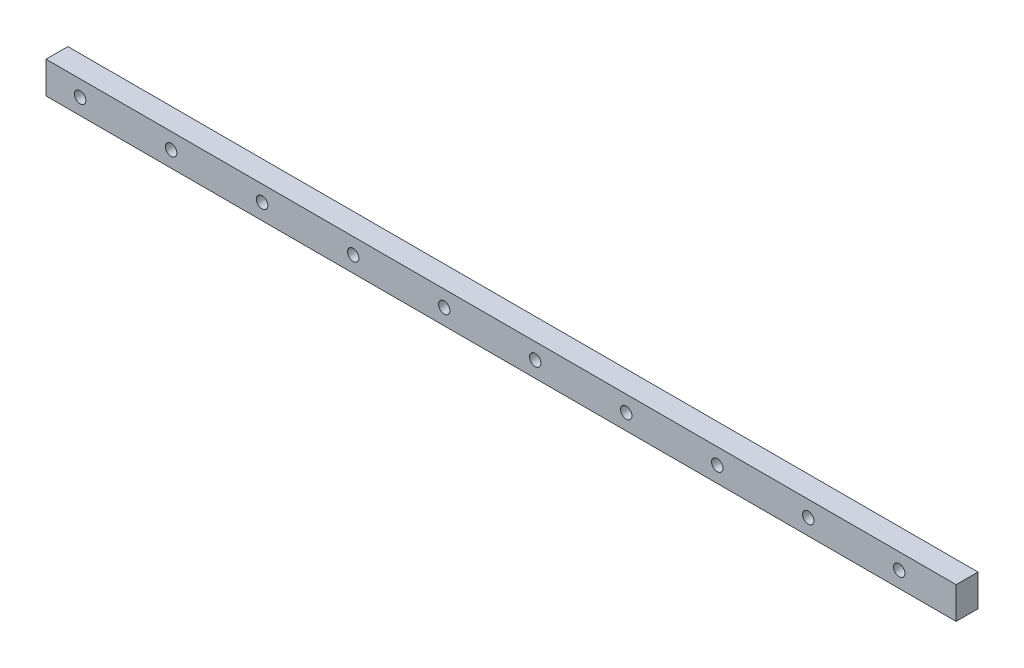
ISO-10303-21;
HEADER;
FILE_DESCRIPTION(('STEP AP214'),'2;1');
FILE_NAME('part.step','',(''),(''),'','','');
FILE_SCHEMA(('AUTOMOTIVE_DESIGN { 1 0 10303 214 1 1 1 1 }'));
ENDSEC;
DATA;
#1=APPLICATION_CONTEXT('core data for automotive mechanical design processes');
#2=APPLICATION_PROTOCOL_DEFINITION('international standard','automotive_design',2000,#1);
#3=PRODUCT_CONTEXT('',#1,'mechanical');
#4=PRODUCT('Part','Part','',(#3));
#5=PRODUCT_RELATED_PRODUCT_CATEGORY('part','',(#4));
#6=PRODUCT_DEFINITION_FORMATION('','',#4);
#7=PRODUCT_DEFINITION_CONTEXT('part definition',#1,'design');
#8=PRODUCT_DEFINITION('design','',#6,#7);
#9=PRODUCT_DEFINITION_SHAPE('','',#8);
#10=(LENGTH_UNIT() NAMED_UNIT(*) SI_UNIT(.MILLI.,.METRE.));
#11=(NAMED_UNIT(*) PLANE_ANGLE_UNIT() SI_UNIT($,.RADIAN.));
#12=(NAMED_UNIT(*) SI_UNIT($,.STERADIAN.) SOLID_ANGLE_UNIT());
#13=UNCERTAINTY_MEASURE_WITH_UNIT(LENGTH_MEASURE(1.E-05),#10,'distance_accuracy_value','');
#14=(GEOMETRIC_REPRESENTATION_CONTEXT(3) GLOBAL_UNCERTAINTY_ASSIGNED_CONTEXT((#13)) GLOBAL_UNIT_ASSIGNED_CONTEXT((#10,
#11,#12)) REPRESENTATION_CONTEXT('',''));
#15=CARTESIAN_POINT('',(0.,0.,0.));
#16=DIRECTION('',(0.,0.,1.));
#17=DIRECTION('',(1.,0.,0.));
#18=AXIS2_PLACEMENT_3D('',#15,#16,#17);
#19=CARTESIAN_POINT('',(0.,0.,4.8));
#20=DIRECTION('',(0.,0.,1.));
#21=DIRECTION('',(1.,0.,0.));
#22=AXIS2_PLACEMENT_3D('',#19,#20,#21);
#23=PLANE('',#22);
#24=CARTESIAN_POINT('',(167.5,-3.5,4.8));
#25=DIRECTION('',(0.,0.,1.));
#26=DIRECTION('',(1.,0.,0.));
#27=AXIS2_PLACEMENT_3D('',#24,#25,#26);
#28=CIRCLE('',#27,1.24999999999998);
#29=CARTESIAN_POINT('',(168.75,-3.5,4.8));
#30=VERTEX_POINT('',#29);
#31=EDGE_CURVE('E165',#30,#30,#28,.T.);
#32=ORIENTED_EDGE('',*,*,#31,.F.);
#33=EDGE_LOOP('',(#32));
#34=FACE_BOUND('',#33,.T.);
#35=CARTESIAN_POINT('',(127.5,-3.5,4.8));
#36=DIRECTION('',(0.,0.,1.));
#37=DIRECTION('',(1.,0.,0.));
#38=AXIS2_PLACEMENT_3D('',#35,#36,#37);
#39=CIRCLE('',#38,1.24999999999998);
#40=CARTESIAN_POINT('',(128.75,-3.5,4.8));
#41=VERTEX_POINT('',#40);
#42=EDGE_CURVE('E153',#41,#41,#39,.T.);
#43=ORIENTED_EDGE('',*,*,#42,.F.);
#44=EDGE_LOOP('',(#43));
#45=FACE_BOUND('',#44,.T.);
#46=CARTESIAN_POINT('',(87.5,-3.5,4.8));
#47=DIRECTION('',(0.,0.,1.));
#48=DIRECTION('',(1.,0.,0.));
#49=AXIS2_PLACEMENT_3D('',#46,#47,#48);
#50=CIRCLE('',#49,1.25000000000001);
#51=CARTESIAN_POINT('',(88.75,-3.5,4.8));
#52=VERTEX_POINT('',#51);
#53=EDGE_CURVE('E141',#52,#52,#50,.T.);
#54=ORIENTED_EDGE('',*,*,#53,.F.);
#55=EDGE_LOOP('',(#54));
#56=FACE_BOUND('',#55,.T.);
#57=CARTESIAN_POINT('',(47.5,-3.5,4.8));
#58=DIRECTION('',(0.,0.,1.));
#59=DIRECTION('',(1.,0.,0.));
#60=AXIS2_PLACEMENT_3D('',#57,#58,#59);
#61=CIRCLE('',#60,1.25);
#62=CARTESIAN_POINT('',(48.75,-3.5,4.8));
#63=VERTEX_POINT('',#62);
#64=EDGE_CURVE('E129',#63,#63,#61,.T.);
#65=ORIENTED_EDGE('',*,*,#64,.F.);
#66=EDGE_LOOP('',(#65));
#67=FACE_BOUND('',#66,.T.);
#68=CARTESIAN_POINT('',(7.5,-3.5,4.8));
#69=DIRECTION('',(0.,0.,1.));
#70=DIRECTION('',(1.,0.,0.));
#71=AXIS2_PLACEMENT_3D('',#68,#69,#70);
#72=CIRCLE('',#71,1.25);
#73=CARTESIAN_POINT('',(8.75,-3.5,4.8));
#74=VERTEX_POINT('',#73);
#75=EDGE_CURVE('E108',#74,#74,#72,.T.);
#76=ORIENTED_EDGE('',*,*,#75,.F.);
#77=EDGE_LOOP('',(#76));
#78=FACE_BOUND('',#77,.T.);
#79=DIRECTION('',(0.,-1.,0.));
#80=VECTOR('',#79,1.);
#81=CARTESIAN_POINT('',(0.,0.,4.8));
#82=LINE('',#81,#80);
#83=CARTESIAN_POINT('',(0.,0.,4.8));
#84=VERTEX_POINT('',#83);
#85=CARTESIAN_POINT('',(0.,-7.,4.8));
#86=VERTEX_POINT('',#85);
#87=EDGE_CURVE('E93',#84,#86,#82,.T.);
#88=ORIENTED_EDGE('',*,*,#87,.T.);
#89=DIRECTION('',(1.,0.,0.));
#90=VECTOR('',#89,1.);
#91=CARTESIAN_POINT('',(0.,-7.,4.8));
#92=LINE('',#91,#90);
#93=CARTESIAN_POINT('',(200.,-7.,4.8));
#94=VERTEX_POINT('',#93);
#95=EDGE_CURVE('E88',#86,#94,#92,.T.);
#96=ORIENTED_EDGE('',*,*,#95,.T.);
#97=DIRECTION('',(0.,1.,0.));
#98=VECTOR('',#97,1.);
#99=CARTESIAN_POINT('',(200.,0.,4.8));
#100=LINE('',#99,#98);
#101=CARTESIAN_POINT('',(200.,0.,4.8));
#102=VERTEX_POINT('',#101);
#103=EDGE_CURVE('E91',#94,#102,#100,.T.);
#104=ORIENTED_EDGE('',*,*,#103,.T.);
#105=DIRECTION('',(-1.,0.,0.));
#106=VECTOR('',#105,1.);
#107=CARTESIAN_POINT('',(0.,0.,4.8));
#108=LINE('',#107,#106);
#109=EDGE_CURVE('E58',#102,#84,#108,.T.);
#110=ORIENTED_EDGE('',*,*,#109,.T.);
#111=EDGE_LOOP('',(#88,#96,#104,#110));
#112=FACE_BOUND('',#111,.T.);
#113=CARTESIAN_POINT('',(27.5,-3.5,4.8));
#114=DIRECTION('',(0.,0.,1.));
#115=DIRECTION('',(1.,0.,0.));
#116=AXIS2_PLACEMENT_3D('',#113,#114,#115);
#117=CIRCLE('',#116,1.25);
#118=CARTESIAN_POINT('',(28.75,-3.5,4.8));
#119=VERTEX_POINT('',#118);
#120=EDGE_CURVE('E123',#119,#119,#117,.T.);
#121=ORIENTED_EDGE('',*,*,#120,.F.);
#122=EDGE_LOOP('',(#121));
#123=FACE_BOUND('',#122,.T.);
#124=CARTESIAN_POINT('',(67.5,-3.5,4.8));
#125=DIRECTION('',(0.,0.,1.));
#126=DIRECTION('',(1.,0.,0.));
#127=AXIS2_PLACEMENT_3D('',#124,#125,#126);
#128=CIRCLE('',#127,1.25);
#129=CARTESIAN_POINT('',(68.75,-3.5,4.8));
#130=VERTEX_POINT('',#129);
#131=EDGE_CURVE('E135',#130,#130,#128,.T.);
#132=ORIENTED_EDGE('',*,*,#131,.F.);
#133=EDGE_LOOP('',(#132));
#134=FACE_BOUND('',#133,.T.);
#135=CARTESIAN_POINT('',(107.5,-3.5,4.8));
#136=DIRECTION('',(0.,0.,1.));
#137=DIRECTION('',(1.,0.,0.));
#138=AXIS2_PLACEMENT_3D('',#135,#136,#137);
#139=CIRCLE('',#138,1.25);
#140=CARTESIAN_POINT('',(108.75,-3.5,4.8));
#141=VERTEX_POINT('',#140);
#142=EDGE_CURVE('E147',#141,#141,#139,.T.);
#143=ORIENTED_EDGE('',*,*,#142,.F.);
#144=EDGE_LOOP('',(#143));
#145=FACE_BOUND('',#144,.T.);
#146=CARTESIAN_POINT('',(147.5,-3.5,4.8));
#147=DIRECTION('',(0.,0.,1.));
#148=DIRECTION('',(1.,0.,0.));
#149=AXIS2_PLACEMENT_3D('',#146,#147,#148);
#150=CIRCLE('',#149,1.24999999999998);
#151=CARTESIAN_POINT('',(148.75,-3.5,4.8));
#152=VERTEX_POINT('',#151);
#153=EDGE_CURVE('E159',#152,#152,#150,.T.);
#154=ORIENTED_EDGE('',*,*,#153,.F.);
#155=EDGE_LOOP('',(#154));
#156=FACE_BOUND('',#155,.T.);
#157=CARTESIAN_POINT('',(187.5,-3.5,4.8));
#158=DIRECTION('',(0.,0.,1.));
#159=DIRECTION('',(1.,0.,0.));
#160=AXIS2_PLACEMENT_3D('',#157,#158,#159);
#161=CIRCLE('',#160,1.24999999999998);
#162=CARTESIAN_POINT('',(188.75,-3.5,4.8));
#163=VERTEX_POINT('',#162);
#164=EDGE_CURVE('E171',#163,#163,#161,.T.);
#165=ORIENTED_EDGE('',*,*,#164,.F.);
#166=EDGE_LOOP('',(#165));
#167=FACE_BOUND('',#166,.T.);
#168=ADVANCED_FACE('F41',(#34,#45,#56,#67,#78,#112,#123,#134,#145,#156,#167),#23,.T.);
#169=CARTESIAN_POINT('',(0.,0.,0.));
#170=DIRECTION('',(0.,0.,1.));
#171=DIRECTION('',(1.,0.,0.));
#172=AXIS2_PLACEMENT_3D('',#169,#170,#171);
#173=PLANE('',#172);
#174=DIRECTION('',(0.,-1.,0.));
#175=VECTOR('',#174,1.);
#176=CARTESIAN_POINT('',(0.,0.,0.));
#177=LINE('',#176,#175);
#178=CARTESIAN_POINT('',(0.,0.,0.));
#179=VERTEX_POINT('',#178);
#180=CARTESIAN_POINT('',(0.,-7.,0.));
#181=VERTEX_POINT('',#180);
#182=EDGE_CURVE('E105',#179,#181,#177,.T.);
#183=ORIENTED_EDGE('',*,*,#182,.F.);
#184=DIRECTION('',(-1.,0.,0.));
#185=VECTOR('',#184,1.);
#186=CARTESIAN_POINT('',(0.,0.,0.));
#187=LINE('',#186,#185);
#188=CARTESIAN_POINT('',(200.,0.,0.));
#189=VERTEX_POINT('',#188);
#190=EDGE_CURVE('E81',#189,#179,#187,.T.);
#191=ORIENTED_EDGE('',*,*,#190,.F.);
#192=DIRECTION('',(0.,1.,0.));
#193=VECTOR('',#192,1.);
#194=CARTESIAN_POINT('',(200.,0.,0.));
#195=LINE('',#194,#193);
#196=CARTESIAN_POINT('',(200.,-7.,0.));
#197=VERTEX_POINT('',#196);
#198=EDGE_CURVE('E75',#197,#189,#195,.T.);
#199=ORIENTED_EDGE('',*,*,#198,.F.);
#200=DIRECTION('',(1.,0.,0.));
#201=VECTOR('',#200,1.);
#202=CARTESIAN_POINT('',(0.,-7.,0.));
#203=LINE('',#202,#201);
#204=EDGE_CURVE('E97',#181,#197,#203,.T.);
#205=ORIENTED_EDGE('',*,*,#204,.F.);
#206=EDGE_LOOP('',(#183,#191,#199,#205));
#207=FACE_BOUND('',#206,.T.);
#208=CARTESIAN_POINT('',(7.5,-3.5,0.));
#209=DIRECTION('',(0.,0.,1.));
#210=DIRECTION('',(1.,0.,0.));
#211=AXIS2_PLACEMENT_3D('',#208,#209,#210);
#212=CIRCLE('',#211,1.25);
#213=CARTESIAN_POINT('',(8.75,-3.5,0.));
#214=VERTEX_POINT('',#213);
#215=EDGE_CURVE('E120',#214,#214,#212,.T.);
#216=ORIENTED_EDGE('',*,*,#215,.T.);
#217=EDGE_LOOP('',(#216));
#218=FACE_BOUND('',#217,.T.);
#219=CARTESIAN_POINT('',(27.5,-3.5,0.));
#220=DIRECTION('',(0.,0.,1.));
#221=DIRECTION('',(1.,0.,0.));
#222=AXIS2_PLACEMENT_3D('',#219,#220,#221);
#223=CIRCLE('',#222,1.25);
#224=CARTESIAN_POINT('',(28.75,-3.5,0.));
#225=VERTEX_POINT('',#224);
#226=EDGE_CURVE('E126',#225,#225,#223,.T.);
#227=ORIENTED_EDGE('',*,*,#226,.T.);
#228=EDGE_LOOP('',(#227));
#229=FACE_BOUND('',#228,.T.);
#230=CARTESIAN_POINT('',(47.5,-3.5,0.));
#231=DIRECTION('',(0.,0.,1.));
#232=DIRECTION('',(1.,0.,0.));
#233=AXIS2_PLACEMENT_3D('',#230,#231,#232);
#234=CIRCLE('',#233,1.25);
#235=CARTESIAN_POINT('',(48.75,-3.5,0.));
#236=VERTEX_POINT('',#235);
#237=EDGE_CURVE('E132',#236,#236,#234,.T.);
#238=ORIENTED_EDGE('',*,*,#237,.T.);
#239=EDGE_LOOP('',(#238));
#240=FACE_BOUND('',#239,.T.);
#241=CARTESIAN_POINT('',(67.5,-3.5,0.));
#242=DIRECTION('',(0.,0.,1.));
#243=DIRECTION('',(1.,0.,0.));
#244=AXIS2_PLACEMENT_3D('',#241,#242,#243);
#245=CIRCLE('',#244,1.25);
#246=CARTESIAN_POINT('',(68.75,-3.5,0.));
#247=VERTEX_POINT('',#246);
#248=EDGE_CURVE('E138',#247,#247,#245,.T.);
#249=ORIENTED_EDGE('',*,*,#248,.T.);
#250=EDGE_LOOP('',(#249));
#251=FACE_BOUND('',#250,.T.);
#252=CARTESIAN_POINT('',(87.5,-3.5,0.));
#253=DIRECTION('',(0.,0.,1.));
#254=DIRECTION('',(1.,0.,0.));
#255=AXIS2_PLACEMENT_3D('',#252,#253,#254);
#256=CIRCLE('',#255,1.25000000000001);
#257=CARTESIAN_POINT('',(88.75,-3.5,0.));
#258=VERTEX_POINT('',#257);
#259=EDGE_CURVE('E144',#258,#258,#256,.T.);
#260=ORIENTED_EDGE('',*,*,#259,.T.);
#261=EDGE_LOOP('',(#260));
#262=FACE_BOUND('',#261,.T.);
#263=CARTESIAN_POINT('',(107.5,-3.5,0.));
#264=DIRECTION('',(0.,0.,1.));
#265=DIRECTION('',(1.,0.,0.));
#266=AXIS2_PLACEMENT_3D('',#263,#264,#265);
#267=CIRCLE('',#266,1.25);
#268=CARTESIAN_POINT('',(108.75,-3.5,0.));
#269=VERTEX_POINT('',#268);
#270=EDGE_CURVE('E150',#269,#269,#267,.T.);
#271=ORIENTED_EDGE('',*,*,#270,.T.);
#272=EDGE_LOOP('',(#271));
#273=FACE_BOUND('',#272,.T.);
#274=CARTESIAN_POINT('',(127.5,-3.5,0.));
#275=DIRECTION('',(0.,0.,1.));
#276=DIRECTION('',(1.,0.,0.));
#277=AXIS2_PLACEMENT_3D('',#274,#275,#276);
#278=CIRCLE('',#277,1.24999999999998);
#279=CARTESIAN_POINT('',(128.75,-3.5,0.));
#280=VERTEX_POINT('',#279);
#281=EDGE_CURVE('E156',#280,#280,#278,.T.);
#282=ORIENTED_EDGE('',*,*,#281,.T.);
#283=EDGE_LOOP('',(#282));
#284=FACE_BOUND('',#283,.T.);
#285=CARTESIAN_POINT('',(147.5,-3.5,0.));
#286=DIRECTION('',(0.,0.,1.));
#287=DIRECTION('',(1.,0.,0.));
#288=AXIS2_PLACEMENT_3D('',#285,#286,#287);
#289=CIRCLE('',#288,1.24999999999998);
#290=CARTESIAN_POINT('',(148.75,-3.5,0.));
#291=VERTEX_POINT('',#290);
#292=EDGE_CURVE('E162',#291,#291,#289,.T.);
#293=ORIENTED_EDGE('',*,*,#292,.T.);
#294=EDGE_LOOP('',(#293));
#295=FACE_BOUND('',#294,.T.);
#296=CARTESIAN_POINT('',(167.5,-3.5,0.));
#297=DIRECTION('',(0.,0.,1.));
#298=DIRECTION('',(1.,0.,0.));
#299=AXIS2_PLACEMENT_3D('',#296,#297,#298);
#300=CIRCLE('',#299,1.24999999999998);
#301=CARTESIAN_POINT('',(168.75,-3.5,0.));
#302=VERTEX_POINT('',#301);
#303=EDGE_CURVE('E168',#302,#302,#300,.T.);
#304=ORIENTED_EDGE('',*,*,#303,.T.);
#305=EDGE_LOOP('',(#304));
#306=FACE_BOUND('',#305,.T.);
#307=CARTESIAN_POINT('',(187.5,-3.5,0.));
#308=DIRECTION('',(0.,0.,1.));
#309=DIRECTION('',(1.,0.,0.));
#310=AXIS2_PLACEMENT_3D('',#307,#308,#309);
#311=CIRCLE('',#310,1.24999999999998);
#312=CARTESIAN_POINT('',(188.75,-3.5,0.));
#313=VERTEX_POINT('',#312);
#314=EDGE_CURVE('E174',#313,#313,#311,.T.);
#315=ORIENTED_EDGE('',*,*,#314,.T.);
#316=EDGE_LOOP('',(#315));
#317=FACE_BOUND('',#316,.T.);
#318=ADVANCED_FACE('F116',(#207,#218,#229,#240,#251,#262,#273,#284,#295,#306,#317),#173,.F.);
#319=CARTESIAN_POINT('',(0.,0.,4.8));
#320=DIRECTION('',(1.,0.,0.));
#321=DIRECTION('',(0.,1.,0.));
#322=AXIS2_PLACEMENT_3D('',#319,#320,#321);
#323=PLANE('',#322);
#324=ORIENTED_EDGE('',*,*,#182,.T.);
#325=DIRECTION('',(0.,0.,-1.));
#326=VECTOR('',#325,1.);
#327=CARTESIAN_POINT('',(0.,-7.,4.8));
#328=LINE('',#327,#326);
#329=EDGE_CURVE('E11',#86,#181,#328,.T.);
#330=ORIENTED_EDGE('',*,*,#329,.F.);
#331=ORIENTED_EDGE('',*,*,#87,.F.);
#332=DIRECTION('',(0.,0.,-1.));
#333=VECTOR('',#332,1.);
#334=CARTESIAN_POINT('',(0.,0.,4.8));
#335=LINE('',#334,#333);
#336=EDGE_CURVE('E101',#84,#179,#335,.T.);
#337=ORIENTED_EDGE('',*,*,#336,.T.);
#338=EDGE_LOOP('',(#324,#330,#331,#337));
#339=FACE_BOUND('',#338,.T.);
#340=ADVANCED_FACE('F43',(#339),#323,.F.);
#341=CARTESIAN_POINT('',(0.,-7.,4.8));
#342=DIRECTION('',(0.,1.,0.));
#343=DIRECTION('',(0.,0.,1.));
#344=AXIS2_PLACEMENT_3D('',#341,#342,#343);
#345=PLANE('',#344);
#346=ORIENTED_EDGE('',*,*,#204,.T.);
#347=DIRECTION('',(0.,0.,-1.));
#348=VECTOR('',#347,1.);
#349=CARTESIAN_POINT('',(200.,-7.,4.8));
#350=LINE('',#349,#348);
#351=EDGE_CURVE('E50',#94,#197,#350,.T.);
#352=ORIENTED_EDGE('',*,*,#351,.F.);
#353=ORIENTED_EDGE('',*,*,#95,.F.);
#354=ORIENTED_EDGE('',*,*,#329,.T.);
#355=EDGE_LOOP('',(#346,#352,#353,#354));
#356=FACE_BOUND('',#355,.T.);
#357=ADVANCED_FACE('F96',(#356),#345,.F.);
#358=CARTESIAN_POINT('',(200.,0.,4.8));
#359=DIRECTION('',(-1.,0.,0.));
#360=DIRECTION('',(0.,0.,1.));
#361=AXIS2_PLACEMENT_3D('',#358,#359,#360);
#362=PLANE('',#361);
#363=ORIENTED_EDGE('',*,*,#198,.T.);
#364=DIRECTION('',(0.,0.,-1.));
#365=VECTOR('',#364,1.);
#366=CARTESIAN_POINT('',(200.,0.,4.8));
#367=LINE('',#366,#365);
#368=EDGE_CURVE('E98',#102,#189,#367,.T.);
#369=ORIENTED_EDGE('',*,*,#368,.F.);
#370=ORIENTED_EDGE('',*,*,#103,.F.);
#371=ORIENTED_EDGE('',*,*,#351,.T.);
#372=EDGE_LOOP('',(#363,#369,#370,#371));
#373=FACE_BOUND('',#372,.T.);
#374=ADVANCED_FACE('F99',(#373),#362,.F.);
#375=CARTESIAN_POINT('',(0.,0.,4.8));
#376=DIRECTION('',(0.,-1.,0.));
#377=DIRECTION('',(0.,0.,-1.));
#378=AXIS2_PLACEMENT_3D('',#375,#376,#377);
#379=PLANE('',#378);
#380=ORIENTED_EDGE('',*,*,#190,.T.);
#381=ORIENTED_EDGE('',*,*,#336,.F.);
#382=ORIENTED_EDGE('',*,*,#109,.F.);
#383=ORIENTED_EDGE('',*,*,#368,.T.);
#384=EDGE_LOOP('',(#380,#381,#382,#383));
#385=FACE_BOUND('',#384,.T.);
#386=ADVANCED_FACE('F113',(#385),#379,.F.);
#387=CARTESIAN_POINT('',(7.5,-3.5,4.8));
#388=DIRECTION('',(0.,0.,-1.));
#389=DIRECTION('',(-1.,0.,0.));
#390=AXIS2_PLACEMENT_3D('',#387,#388,#389);
#391=CYLINDRICAL_SURFACE('',#390,1.25);
#392=ORIENTED_EDGE('',*,*,#75,.T.);
#393=EDGE_LOOP('',(#392));
#394=FACE_BOUND('',#393,.T.);
#395=ORIENTED_EDGE('',*,*,#215,.F.);
#396=EDGE_LOOP('',(#395));
#397=FACE_BOUND('',#396,.T.);
#398=ADVANCED_FACE('F193',(#394,#397),#391,.F.);
#399=CARTESIAN_POINT('',(27.5,-3.5,4.8));
#400=DIRECTION('',(0.,0.,-1.));
#401=DIRECTION('',(-1.,0.,0.));
#402=AXIS2_PLACEMENT_3D('',#399,#400,#401);
#403=CYLINDRICAL_SURFACE('',#402,1.25);
#404=ORIENTED_EDGE('',*,*,#120,.T.);
#405=EDGE_LOOP('',(#404));
#406=FACE_BOUND('',#405,.T.);
#407=ORIENTED_EDGE('',*,*,#226,.F.);
#408=EDGE_LOOP('',(#407));
#409=FACE_BOUND('',#408,.T.);
#410=ADVANCED_FACE('F238',(#406,#409),#403,.F.);
#411=CARTESIAN_POINT('',(47.5,-3.5,4.8));
#412=DIRECTION('',(0.,0.,-1.));
#413=DIRECTION('',(-1.,0.,0.));
#414=AXIS2_PLACEMENT_3D('',#411,#412,#413);
#415=CYLINDRICAL_SURFACE('',#414,1.25);
#416=ORIENTED_EDGE('',*,*,#64,.T.);
#417=EDGE_LOOP('',(#416));
#418=FACE_BOUND('',#417,.T.);
#419=ORIENTED_EDGE('',*,*,#237,.F.);
#420=EDGE_LOOP('',(#419));
#421=FACE_BOUND('',#420,.T.);
#422=ADVANCED_FACE('F246',(#418,#421),#415,.F.);
#423=CARTESIAN_POINT('',(67.5,-3.5,4.8));
#424=DIRECTION('',(0.,0.,-1.));
#425=DIRECTION('',(-1.,0.,0.));
#426=AXIS2_PLACEMENT_3D('',#423,#424,#425);
#427=CYLINDRICAL_SURFACE('',#426,1.25);
#428=ORIENTED_EDGE('',*,*,#131,.T.);
#429=EDGE_LOOP('',(#428));
#430=FACE_BOUND('',#429,.T.);
#431=ORIENTED_EDGE('',*,*,#248,.F.);
#432=EDGE_LOOP('',(#431));
#433=FACE_BOUND('',#432,.T.);
#434=ADVANCED_FACE('F254',(#430,#433),#427,.F.);
#435=CARTESIAN_POINT('',(87.5,-3.5,4.8));
#436=DIRECTION('',(0.,0.,-1.));
#437=DIRECTION('',(-1.,0.,0.));
#438=AXIS2_PLACEMENT_3D('',#435,#436,#437);
#439=CYLINDRICAL_SURFACE('',#438,1.25000000000001);
#440=ORIENTED_EDGE('',*,*,#53,.T.);
#441=EDGE_LOOP('',(#440));
#442=FACE_BOUND('',#441,.T.);
#443=ORIENTED_EDGE('',*,*,#259,.F.);
#444=EDGE_LOOP('',(#443));
#445=FACE_BOUND('',#444,.T.);
#446=ADVANCED_FACE('F263',(#442,#445),#439,.F.);
#447=CARTESIAN_POINT('',(107.5,-3.5,4.8));
#448=DIRECTION('',(0.,0.,-1.));
#449=DIRECTION('',(-1.,0.,0.));
#450=AXIS2_PLACEMENT_3D('',#447,#448,#449);
#451=CYLINDRICAL_SURFACE('',#450,1.25);
#452=ORIENTED_EDGE('',*,*,#142,.T.);
#453=EDGE_LOOP('',(#452));
#454=FACE_BOUND('',#453,.T.);
#455=ORIENTED_EDGE('',*,*,#270,.F.);
#456=EDGE_LOOP('',(#455));
#457=FACE_BOUND('',#456,.T.);
#458=ADVANCED_FACE('F272',(#454,#457),#451,.F.);
#459=CARTESIAN_POINT('',(127.5,-3.5,4.8));
#460=DIRECTION('',(0.,0.,-1.));
#461=DIRECTION('',(-1.,0.,0.));
#462=AXIS2_PLACEMENT_3D('',#459,#460,#461);
#463=CYLINDRICAL_SURFACE('',#462,1.24999999999998);
#464=ORIENTED_EDGE('',*,*,#42,.T.);
#465=EDGE_LOOP('',(#464));
#466=FACE_BOUND('',#465,.T.);
#467=ORIENTED_EDGE('',*,*,#281,.F.);
#468=EDGE_LOOP('',(#467));
#469=FACE_BOUND('',#468,.T.);
#470=ADVANCED_FACE('F281',(#466,#469),#463,.F.);
#471=CARTESIAN_POINT('',(147.5,-3.5,4.8));
#472=DIRECTION('',(0.,0.,-1.));
#473=DIRECTION('',(-1.,0.,0.));
#474=AXIS2_PLACEMENT_3D('',#471,#472,#473);
#475=CYLINDRICAL_SURFACE('',#474,1.24999999999998);
#476=ORIENTED_EDGE('',*,*,#153,.T.);
#477=EDGE_LOOP('',(#476));
#478=FACE_BOUND('',#477,.T.);
#479=ORIENTED_EDGE('',*,*,#292,.F.);
#480=EDGE_LOOP('',(#479));
#481=FACE_BOUND('',#480,.T.);
#482=ADVANCED_FACE('F290',(#478,#481),#475,.F.);
#483=CARTESIAN_POINT('',(167.5,-3.5,4.8));
#484=DIRECTION('',(0.,0.,-1.));
#485=DIRECTION('',(-1.,0.,0.));
#486=AXIS2_PLACEMENT_3D('',#483,#484,#485);
#487=CYLINDRICAL_SURFACE('',#486,1.24999999999998);
#488=ORIENTED_EDGE('',*,*,#31,.T.);
#489=EDGE_LOOP('',(#488));
#490=FACE_BOUND('',#489,.T.);
#491=ORIENTED_EDGE('',*,*,#303,.F.);
#492=EDGE_LOOP('',(#491));
#493=FACE_BOUND('',#492,.T.);
#494=ADVANCED_FACE('F299',(#490,#493),#487,.F.);
#495=CARTESIAN_POINT('',(187.5,-3.5,4.8));
#496=DIRECTION('',(0.,0.,-1.));
#497=DIRECTION('',(-1.,0.,0.));
#498=AXIS2_PLACEMENT_3D('',#495,#496,#497);
#499=CYLINDRICAL_SURFACE('',#498,1.24999999999998);
#500=ORIENTED_EDGE('',*,*,#164,.T.);
#501=EDGE_LOOP('',(#500));
#502=FACE_BOUND('',#501,.T.);
#503=ORIENTED_EDGE('',*,*,#314,.F.);
#504=EDGE_LOOP('',(#503));
#505=FACE_BOUND('',#504,.T.);
#506=ADVANCED_FACE('F180',(#502,#505),#499,.F.);
#507=CLOSED_SHELL('',(#168,#318,#340,#357,#374,#386,#398,#410,#422,#434,#446,#458,#470,#482,
#494,#506));
#508=MANIFOLD_SOLID_BREP('B2',#507);
#509=ADVANCED_BREP_SHAPE_REPRESENTATION('',(#18,#508),#14);
#510=SHAPE_DEFINITION_REPRESENTATION(#9,#509);
ENDSEC;
END-ISO-10303-21;
